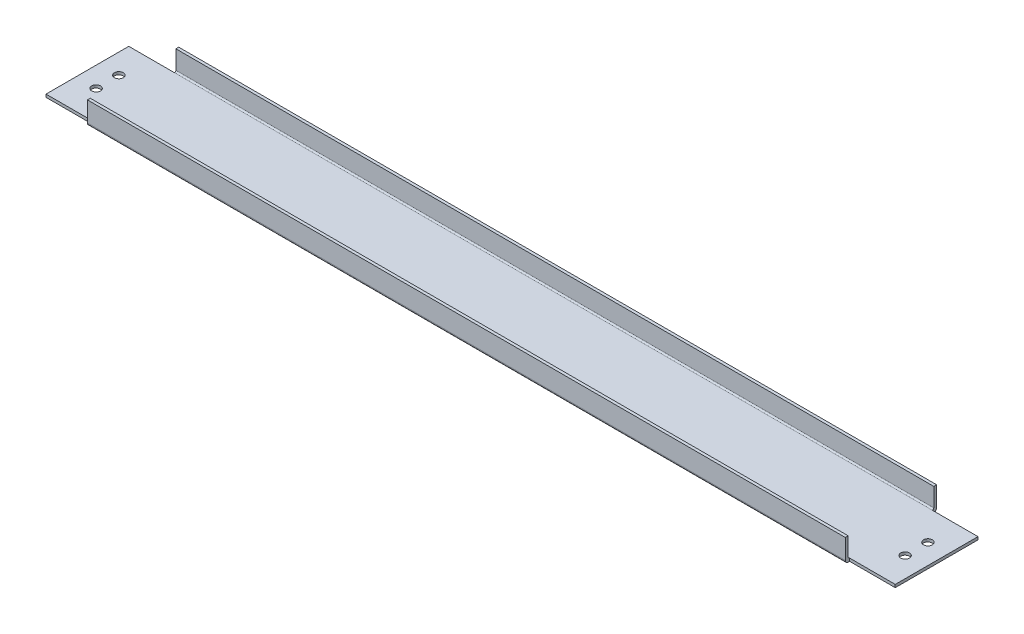
ISO-10303-21;
HEADER;
FILE_DESCRIPTION(('STEP AP214'),'2;1');
FILE_NAME('part.step','',(''),(''),'','','');
FILE_SCHEMA(('AUTOMOTIVE_DESIGN { 1 0 10303 214 1 1 1 1 }'));
ENDSEC;
DATA;
#1=APPLICATION_CONTEXT('core data for automotive mechanical design processes');
#2=APPLICATION_PROTOCOL_DEFINITION('international standard','automotive_design',2000,#1);
#3=PRODUCT_CONTEXT('',#1,'mechanical');
#4=PRODUCT('Part','Part','',(#3));
#5=PRODUCT_RELATED_PRODUCT_CATEGORY('part','',(#4));
#6=PRODUCT_DEFINITION_FORMATION('','',#4);
#7=PRODUCT_DEFINITION_CONTEXT('part definition',#1,'design');
#8=PRODUCT_DEFINITION('design','',#6,#7);
#9=PRODUCT_DEFINITION_SHAPE('','',#8);
#10=(LENGTH_UNIT() NAMED_UNIT(*) SI_UNIT(.MILLI.,.METRE.));
#11=(NAMED_UNIT(*) PLANE_ANGLE_UNIT() SI_UNIT($,.RADIAN.));
#12=(NAMED_UNIT(*) SI_UNIT($,.STERADIAN.) SOLID_ANGLE_UNIT());
#13=UNCERTAINTY_MEASURE_WITH_UNIT(LENGTH_MEASURE(1.E-05),#10,'distance_accuracy_value','');
#14=(GEOMETRIC_REPRESENTATION_CONTEXT(3) GLOBAL_UNCERTAINTY_ASSIGNED_CONTEXT((#13)) GLOBAL_UNIT_ASSIGNED_CONTEXT((#10,
#11,#12)) REPRESENTATION_CONTEXT('',''));
#15=CARTESIAN_POINT('',(0.,0.,0.));
#16=DIRECTION('',(0.,0.,1.));
#17=DIRECTION('',(1.,0.,0.));
#18=AXIS2_PLACEMENT_3D('',#15,#16,#17);
#19=CARTESIAN_POINT('',(-210.82,1.5875,23.8125));
#20=DIRECTION('',(1.,0.,0.));
#21=DIRECTION('',(0.,0.,1.));
#22=AXIS2_PLACEMENT_3D('',#19,#20,#21);
#23=PLANE('',#22);
#24=CARTESIAN_POINT('',(-210.82,2.38125,23.01875));
#25=DIRECTION('',(-1.,0.,0.));
#26=DIRECTION('',(0.,0.,1.));
#27=AXIS2_PLACEMENT_3D('',#24,#25,#26);
#28=CIRCLE('',#27,0.79375);
#29=CARTESIAN_POINT('',(-210.82,1.5875,23.01875));
#30=VERTEX_POINT('',#29);
#31=CARTESIAN_POINT('',(-210.82,2.38125000000001,23.8125));
#32=VERTEX_POINT('',#31);
#33=EDGE_CURVE('E414',#30,#32,#28,.T.);
#34=ORIENTED_EDGE('',*,*,#33,.F.);
#35=DIRECTION('',(0.,-1.,0.));
#36=VECTOR('',#35,1.);
#37=CARTESIAN_POINT('',(-210.82,1.5875,23.01875));
#38=LINE('',#37,#36);
#39=CARTESIAN_POINT('',(-210.82,0.,23.01875));
#40=VERTEX_POINT('',#39);
#41=EDGE_CURVE('E188',#30,#40,#38,.T.);
#42=ORIENTED_EDGE('',*,*,#41,.T.);
#43=DIRECTION('',(0.,0.,-1.));
#44=VECTOR('',#43,1.);
#45=CARTESIAN_POINT('',(-210.82,0.,23.8125));
#46=LINE('',#45,#44);
#47=CARTESIAN_POINT('',(-210.82,0.,23.8125));
#48=VERTEX_POINT('',#47);
#49=EDGE_CURVE('E284',#48,#40,#46,.T.);
#50=ORIENTED_EDGE('',*,*,#49,.F.);
#51=CARTESIAN_POINT('',(-210.82,1.5875,23.8125));
#52=DIRECTION('',(1.,0.,0.));
#53=DIRECTION('',(0.,0.,1.));
#54=AXIS2_PLACEMENT_3D('',#51,#52,#53);
#55=CIRCLE('',#54,1.5875);
#56=CARTESIAN_POINT('',(-210.82,1.58750000000001,25.4));
#57=VERTEX_POINT('',#56);
#58=EDGE_CURVE('E287',#57,#48,#55,.T.);
#59=ORIENTED_EDGE('',*,*,#58,.F.);
#60=DIRECTION('',(0.,-1.,0.));
#61=VECTOR('',#60,1.);
#62=CARTESIAN_POINT('',(-210.82,1.58750000000001,25.4));
#63=LINE('',#62,#61);
#64=CARTESIAN_POINT('',(-210.82,12.7,25.4));
#65=VERTEX_POINT('',#64);
#66=EDGE_CURVE('E301',#65,#57,#63,.T.);
#67=ORIENTED_EDGE('',*,*,#66,.F.);
#68=DIRECTION('',(0.,0.,1.));
#69=VECTOR('',#68,1.);
#70=CARTESIAN_POINT('',(-210.82,12.7,23.8125));
#71=LINE('',#70,#69);
#72=CARTESIAN_POINT('',(-210.82,12.7,23.8125));
#73=VERTEX_POINT('',#72);
#74=EDGE_CURVE('E177',#73,#65,#71,.T.);
#75=ORIENTED_EDGE('',*,*,#74,.F.);
#76=DIRECTION('',(0.,1.,0.));
#77=VECTOR('',#76,1.);
#78=CARTESIAN_POINT('',(-210.82,2.38125000000001,23.8125));
#79=LINE('',#78,#77);
#80=EDGE_CURVE('E419',#32,#73,#79,.T.);
#81=ORIENTED_EDGE('',*,*,#80,.F.);
#82=EDGE_LOOP('',(#34,#42,#50,#59,#67,#75,#81));
#83=FACE_BOUND('',#82,.T.);
#84=ADVANCED_FACE('F37',(#83),#23,.F.);
#85=CARTESIAN_POINT('',(210.82,1.5875,23.8125));
#86=DIRECTION('',(-1.,0.,0.));
#87=DIRECTION('',(0.,0.,1.));
#88=AXIS2_PLACEMENT_3D('',#85,#86,#87);
#89=PLANE('',#88);
#90=DIRECTION('',(0.,1.,0.));
#91=VECTOR('',#90,1.);
#92=CARTESIAN_POINT('',(210.82,0.,-23.01875));
#93=LINE('',#92,#91);
#94=CARTESIAN_POINT('',(210.82,0.,-23.01875));
#95=VERTEX_POINT('',#94);
#96=CARTESIAN_POINT('',(210.82,1.58750000000001,-23.01875));
#97=VERTEX_POINT('',#96);
#98=EDGE_CURVE('E54',#95,#97,#93,.T.);
#99=ORIENTED_EDGE('',*,*,#98,.F.);
#100=DIRECTION('',(0.,0.,-1.));
#101=VECTOR('',#100,1.);
#102=CARTESIAN_POINT('',(210.82,0.,23.8125));
#103=LINE('',#102,#101);
#104=CARTESIAN_POINT('',(210.82,0.,-23.8125));
#105=VERTEX_POINT('',#104);
#106=EDGE_CURVE('E322',#95,#105,#103,.T.);
#107=ORIENTED_EDGE('',*,*,#106,.T.);
#108=CARTESIAN_POINT('',(210.82,1.5875,-23.8125));
#109=DIRECTION('',(1.,0.,0.));
#110=DIRECTION('',(0.,0.,-1.));
#111=AXIS2_PLACEMENT_3D('',#108,#109,#110);
#112=CIRCLE('',#111,1.5875);
#113=CARTESIAN_POINT('',(210.82,1.58750000000001,-25.4));
#114=VERTEX_POINT('',#113);
#115=EDGE_CURVE('E350',#105,#114,#112,.T.);
#116=ORIENTED_EDGE('',*,*,#115,.T.);
#117=DIRECTION('',(0.,1.,0.));
#118=VECTOR('',#117,1.);
#119=CARTESIAN_POINT('',(210.82,12.7,-25.4));
#120=LINE('',#119,#118);
#121=CARTESIAN_POINT('',(210.82,12.7,-25.4));
#122=VERTEX_POINT('',#121);
#123=EDGE_CURVE('E391',#114,#122,#120,.T.);
#124=ORIENTED_EDGE('',*,*,#123,.T.);
#125=DIRECTION('',(0.,0.,1.));
#126=VECTOR('',#125,1.);
#127=CARTESIAN_POINT('',(210.82,12.7,-23.8125));
#128=LINE('',#127,#126);
#129=CARTESIAN_POINT('',(210.82,12.7,-23.8125));
#130=VERTEX_POINT('',#129);
#131=EDGE_CURVE('E390',#122,#130,#128,.T.);
#132=ORIENTED_EDGE('',*,*,#131,.T.);
#133=DIRECTION('',(0.,-1.,0.));
#134=VECTOR('',#133,1.);
#135=CARTESIAN_POINT('',(210.82,2.38125000000001,-23.8125));
#136=LINE('',#135,#134);
#137=CARTESIAN_POINT('',(210.82,2.38125000000001,-23.8125));
#138=VERTEX_POINT('',#137);
#139=EDGE_CURVE('E388',#130,#138,#136,.T.);
#140=ORIENTED_EDGE('',*,*,#139,.T.);
#141=CARTESIAN_POINT('',(210.82,2.38125000000001,-23.01875));
#142=DIRECTION('',(-1.,0.,0.));
#143=DIRECTION('',(0.,0.,1.));
#144=AXIS2_PLACEMENT_3D('',#141,#142,#143);
#145=CIRCLE('',#144,0.79375);
#146=EDGE_CURVE('E386',#138,#97,#145,.T.);
#147=ORIENTED_EDGE('',*,*,#146,.T.);
#148=EDGE_LOOP('',(#99,#107,#116,#124,#132,#140,#147));
#149=FACE_BOUND('',#148,.T.);
#150=ADVANCED_FACE('F252',(#149),#89,.F.);
#151=DIRECTION('',(0.,-1.,0.));
#152=VECTOR('',#151,1.);
#153=CARTESIAN_POINT('',(210.82,1.5875,23.01875));
#154=LINE('',#153,#152);
#155=CARTESIAN_POINT('',(210.82,1.5875,23.01875));
#156=VERTEX_POINT('',#155);
#157=CARTESIAN_POINT('',(210.82,0.,23.01875));
#158=VERTEX_POINT('',#157);
#159=EDGE_CURVE('E304',#156,#158,#154,.T.);
#160=ORIENTED_EDGE('',*,*,#159,.F.);
#161=CARTESIAN_POINT('',(210.82,2.38125,23.01875));
#162=DIRECTION('',(-1.,0.,0.));
#163=DIRECTION('',(0.,0.,1.));
#164=AXIS2_PLACEMENT_3D('',#161,#162,#163);
#165=CIRCLE('',#164,0.79375);
#166=CARTESIAN_POINT('',(210.82,2.38125000000001,23.8125));
#167=VERTEX_POINT('',#166);
#168=EDGE_CURVE('E384',#156,#167,#165,.T.);
#169=ORIENTED_EDGE('',*,*,#168,.T.);
#170=DIRECTION('',(0.,1.,0.));
#171=VECTOR('',#170,1.);
#172=CARTESIAN_POINT('',(210.82,2.38125000000001,23.8125));
#173=LINE('',#172,#171);
#174=CARTESIAN_POINT('',(210.82,12.7,23.8125));
#175=VERTEX_POINT('',#174);
#176=EDGE_CURVE('E62',#167,#175,#173,.T.);
#177=ORIENTED_EDGE('',*,*,#176,.T.);
#178=DIRECTION('',(0.,0.,1.));
#179=VECTOR('',#178,1.);
#180=CARTESIAN_POINT('',(210.82,12.7,23.8125));
#181=LINE('',#180,#179);
#182=CARTESIAN_POINT('',(210.82,12.7,25.4));
#183=VERTEX_POINT('',#182);
#184=EDGE_CURVE('E355',#175,#183,#181,.T.);
#185=ORIENTED_EDGE('',*,*,#184,.T.);
#186=DIRECTION('',(0.,-1.,0.));
#187=VECTOR('',#186,1.);
#188=CARTESIAN_POINT('',(210.82,1.58750000000001,25.4));
#189=LINE('',#188,#187);
#190=CARTESIAN_POINT('',(210.82,1.58750000000001,25.4));
#191=VERTEX_POINT('',#190);
#192=EDGE_CURVE('E351',#183,#191,#189,.T.);
#193=ORIENTED_EDGE('',*,*,#192,.T.);
#194=CARTESIAN_POINT('',(210.82,1.5875,23.8125));
#195=DIRECTION('',(1.,0.,0.));
#196=DIRECTION('',(0.,0.,1.));
#197=AXIS2_PLACEMENT_3D('',#194,#195,#196);
#198=CIRCLE('',#197,1.5875);
#199=CARTESIAN_POINT('',(210.82,0.,23.8125));
#200=VERTEX_POINT('',#199);
#201=EDGE_CURVE('E349',#191,#200,#198,.T.);
#202=ORIENTED_EDGE('',*,*,#201,.T.);
#203=EDGE_CURVE('E348',#200,#158,#103,.T.);
#204=ORIENTED_EDGE('',*,*,#203,.T.);
#205=EDGE_LOOP('',(#160,#169,#177,#185,#193,#202,#204));
#206=FACE_BOUND('',#205,.T.);
#207=ADVANCED_FACE('F259',(#206),#89,.F.);
#208=CARTESIAN_POINT('',(210.82,12.7,23.8125));
#209=DIRECTION('',(0.,-1.,0.));
#210=DIRECTION('',(0.,0.,-1.));
#211=AXIS2_PLACEMENT_3D('',#208,#209,#210);
#212=PLANE('',#211);
#213=DIRECTION('',(-1.,0.,0.));
#214=VECTOR('',#213,1.);
#215=CARTESIAN_POINT('',(210.82,12.7,23.8125));
#216=LINE('',#215,#214);
#217=EDGE_CURVE('E381',#175,#73,#216,.T.);
#218=ORIENTED_EDGE('',*,*,#217,.T.);
#219=ORIENTED_EDGE('',*,*,#74,.T.);
#220=DIRECTION('',(-1.,0.,0.));
#221=VECTOR('',#220,1.);
#222=CARTESIAN_POINT('',(210.82,12.7,25.4));
#223=LINE('',#222,#221);
#224=EDGE_CURVE('E11',#183,#65,#223,.T.);
#225=ORIENTED_EDGE('',*,*,#224,.F.);
#226=ORIENTED_EDGE('',*,*,#184,.F.);
#227=EDGE_LOOP('',(#218,#219,#225,#226));
#228=FACE_BOUND('',#227,.T.);
#229=ADVANCED_FACE('F39',(#228),#212,.F.);
#230=CARTESIAN_POINT('',(210.82,1.58750000000001,25.4));
#231=DIRECTION('',(0.,0.,-1.));
#232=DIRECTION('',(-1.,0.,0.));
#233=AXIS2_PLACEMENT_3D('',#230,#231,#232);
#234=PLANE('',#233);
#235=ORIENTED_EDGE('',*,*,#224,.T.);
#236=ORIENTED_EDGE('',*,*,#66,.T.);
#237=DIRECTION('',(-1.,0.,0.));
#238=VECTOR('',#237,1.);
#239=CARTESIAN_POINT('',(210.82,1.58750000000001,25.4));
#240=LINE('',#239,#238);
#241=EDGE_CURVE('E46',#191,#57,#240,.T.);
#242=ORIENTED_EDGE('',*,*,#241,.F.);
#243=ORIENTED_EDGE('',*,*,#192,.F.);
#244=EDGE_LOOP('',(#235,#236,#242,#243));
#245=FACE_BOUND('',#244,.T.);
#246=ADVANCED_FACE('F436',(#245),#234,.F.);
#247=CARTESIAN_POINT('',(210.82,1.5875,23.8125));
#248=DIRECTION('',(-1.,0.,0.));
#249=DIRECTION('',(0.,0.,1.));
#250=AXIS2_PLACEMENT_3D('',#247,#248,#249);
#251=CYLINDRICAL_SURFACE('',#250,1.5875);
#252=ORIENTED_EDGE('',*,*,#241,.T.);
#253=ORIENTED_EDGE('',*,*,#58,.T.);
#254=DIRECTION('',(-1.,0.,0.));
#255=VECTOR('',#254,1.);
#256=CARTESIAN_POINT('',(210.82,0.,23.8125));
#257=LINE('',#256,#255);
#258=EDGE_CURVE('E364',#200,#48,#257,.T.);
#259=ORIENTED_EDGE('',*,*,#258,.F.);
#260=ORIENTED_EDGE('',*,*,#201,.F.);
#261=EDGE_LOOP('',(#252,#253,#259,#260));
#262=FACE_BOUND('',#261,.T.);
#263=ADVANCED_FACE('F446',(#262),#251,.T.);
#264=CARTESIAN_POINT('',(210.82,0.,23.8125));
#265=DIRECTION('',(0.,1.,0.));
#266=DIRECTION('',(0.,0.,1.));
#267=AXIS2_PLACEMENT_3D('',#264,#265,#266);
#268=PLANE('',#267);
#269=CARTESIAN_POINT('',(-225.044,0.,6.35));
#270=DIRECTION('',(0.,1.,0.));
#271=DIRECTION('',(0.,0.,1.));
#272=AXIS2_PLACEMENT_3D('',#269,#270,#271);
#273=CIRCLE('',#272,2.45745);
#274=CARTESIAN_POINT('',(-225.044,0.,8.80745));
#275=VERTEX_POINT('',#274);
#276=EDGE_CURVE('E41',#275,#275,#273,.T.);
#277=ORIENTED_EDGE('',*,*,#276,.T.);
#278=EDGE_LOOP('',(#277));
#279=FACE_BOUND('',#278,.T.);
#280=CARTESIAN_POINT('',(-225.044,0.,-6.35));
#281=DIRECTION('',(0.,1.,0.));
#282=DIRECTION('',(0.,0.,1.));
#283=AXIS2_PLACEMENT_3D('',#280,#281,#282);
#284=CIRCLE('',#283,2.45745);
#285=CARTESIAN_POINT('',(-225.044,0.,-3.89255));
#286=VERTEX_POINT('',#285);
#287=EDGE_CURVE('E214',#286,#286,#284,.T.);
#288=ORIENTED_EDGE('',*,*,#287,.T.);
#289=EDGE_LOOP('',(#288));
#290=FACE_BOUND('',#289,.T.);
#291=CARTESIAN_POINT('',(225.044,0.,6.35));
#292=DIRECTION('',(0.,1.,0.));
#293=DIRECTION('',(0.,0.,1.));
#294=AXIS2_PLACEMENT_3D('',#291,#292,#293);
#295=CIRCLE('',#294,2.45745);
#296=CARTESIAN_POINT('',(225.044,0.,8.80745));
#297=VERTEX_POINT('',#296);
#298=EDGE_CURVE('E211',#297,#297,#295,.T.);
#299=ORIENTED_EDGE('',*,*,#298,.T.);
#300=EDGE_LOOP('',(#299));
#301=FACE_BOUND('',#300,.T.);
#302=CARTESIAN_POINT('',(225.044,0.,-6.35));
#303=DIRECTION('',(0.,1.,0.));
#304=DIRECTION('',(0.,0.,1.));
#305=AXIS2_PLACEMENT_3D('',#302,#303,#304);
#306=CIRCLE('',#305,2.45745);
#307=CARTESIAN_POINT('',(225.044,0.,-3.89255));
#308=VERTEX_POINT('',#307);
#309=EDGE_CURVE('E207',#308,#308,#306,.T.);
#310=ORIENTED_EDGE('',*,*,#309,.T.);
#311=EDGE_LOOP('',(#310));
#312=FACE_BOUND('',#311,.T.);
#313=ORIENTED_EDGE('',*,*,#258,.T.);
#314=ORIENTED_EDGE('',*,*,#49,.T.);
#315=DIRECTION('',(1.,0.,0.));
#316=VECTOR('',#315,1.);
#317=CARTESIAN_POINT('',(-236.22,0.,23.01875));
#318=LINE('',#317,#316);
#319=CARTESIAN_POINT('',(-236.22,0.,23.01875));
#320=VERTEX_POINT('',#319);
#321=EDGE_CURVE('E697',#320,#40,#318,.T.);
#322=ORIENTED_EDGE('',*,*,#321,.F.);
#323=DIRECTION('',(0.,0.,-1.));
#324=VECTOR('',#323,1.);
#325=CARTESIAN_POINT('',(-236.22,0.,23.01875));
#326=LINE('',#325,#324);
#327=CARTESIAN_POINT('',(-236.22,0.,-23.01875));
#328=VERTEX_POINT('',#327);
#329=EDGE_CURVE('E191',#320,#328,#326,.T.);
#330=ORIENTED_EDGE('',*,*,#329,.T.);
#331=DIRECTION('',(1.,0.,0.));
#332=VECTOR('',#331,1.);
#333=CARTESIAN_POINT('',(-236.22,0.,-23.01875));
#334=LINE('',#333,#332);
#335=CARTESIAN_POINT('',(-210.82,0.,-23.01875));
#336=VERTEX_POINT('',#335);
#337=EDGE_CURVE('E178',#328,#336,#334,.T.);
#338=ORIENTED_EDGE('',*,*,#337,.T.);
#339=CARTESIAN_POINT('',(-210.82,0.,-23.8125));
#340=VERTEX_POINT('',#339);
#341=EDGE_CURVE('E276',#336,#340,#46,.T.);
#342=ORIENTED_EDGE('',*,*,#341,.T.);
#343=DIRECTION('',(-1.,0.,0.));
#344=VECTOR('',#343,1.);
#345=CARTESIAN_POINT('',(210.82,0.,-23.8125));
#346=LINE('',#345,#344);
#347=EDGE_CURVE('E346',#105,#340,#346,.T.);
#348=ORIENTED_EDGE('',*,*,#347,.F.);
#349=ORIENTED_EDGE('',*,*,#106,.F.);
#350=DIRECTION('',(-1.,0.,0.));
#351=VECTOR('',#350,1.);
#352=CARTESIAN_POINT('',(236.22,0.,-23.01875));
#353=LINE('',#352,#351);
#354=CARTESIAN_POINT('',(236.22,0.,-23.01875));
#355=VERTEX_POINT('',#354);
#356=EDGE_CURVE('E329',#355,#95,#353,.T.);
#357=ORIENTED_EDGE('',*,*,#356,.F.);
#358=DIRECTION('',(0.,0.,-1.));
#359=VECTOR('',#358,1.);
#360=CARTESIAN_POINT('',(236.22,0.,23.01875));
#361=LINE('',#360,#359);
#362=CARTESIAN_POINT('',(236.22,0.,23.01875));
#363=VERTEX_POINT('',#362);
#364=EDGE_CURVE('E310',#363,#355,#361,.T.);
#365=ORIENTED_EDGE('',*,*,#364,.F.);
#366=DIRECTION('',(-1.,0.,0.));
#367=VECTOR('',#366,1.);
#368=CARTESIAN_POINT('',(236.22,0.,23.01875));
#369=LINE('',#368,#367);
#370=EDGE_CURVE('E325',#363,#158,#369,.T.);
#371=ORIENTED_EDGE('',*,*,#370,.T.);
#372=ORIENTED_EDGE('',*,*,#203,.F.);
#373=EDGE_LOOP('',(#313,#314,#322,#330,#338,#342,#348,#349,#357,#365,#371,#372));
#374=FACE_BOUND('',#373,.T.);
#375=ADVANCED_FACE('F345',(#279,#290,#301,#312,#374),#268,.F.);
#376=CARTESIAN_POINT('',(210.82,1.5875,-23.8125));
#377=DIRECTION('',(-1.,0.,0.));
#378=DIRECTION('',(0.,0.,1.));
#379=AXIS2_PLACEMENT_3D('',#376,#377,#378);
#380=CYLINDRICAL_SURFACE('',#379,1.5875);
#381=ORIENTED_EDGE('',*,*,#347,.T.);
#382=CARTESIAN_POINT('',(-210.82,1.5875,-23.8125));
#383=DIRECTION('',(1.,0.,0.));
#384=DIRECTION('',(0.,0.,-1.));
#385=AXIS2_PLACEMENT_3D('',#382,#383,#384);
#386=CIRCLE('',#385,1.5875);
#387=CARTESIAN_POINT('',(-210.82,1.58750000000001,-25.4));
#388=VERTEX_POINT('',#387);
#389=EDGE_CURVE('E280',#340,#388,#386,.T.);
#390=ORIENTED_EDGE('',*,*,#389,.T.);
#391=DIRECTION('',(-1.,0.,0.));
#392=VECTOR('',#391,1.);
#393=CARTESIAN_POINT('',(210.82,1.58750000000001,-25.4));
#394=LINE('',#393,#392);
#395=EDGE_CURVE('E367',#114,#388,#394,.T.);
#396=ORIENTED_EDGE('',*,*,#395,.F.);
#397=ORIENTED_EDGE('',*,*,#115,.F.);
#398=EDGE_LOOP('',(#381,#390,#396,#397));
#399=FACE_BOUND('',#398,.T.);
#400=ADVANCED_FACE('F396',(#399),#380,.T.);
#401=CARTESIAN_POINT('',(210.82,12.7,-25.4));
#402=DIRECTION('',(0.,0.,1.));
#403=DIRECTION('',(0.,-1.,0.));
#404=AXIS2_PLACEMENT_3D('',#401,#402,#403);
#405=PLANE('',#404);
#406=ORIENTED_EDGE('',*,*,#395,.T.);
#407=DIRECTION('',(0.,1.,0.));
#408=VECTOR('',#407,1.);
#409=CARTESIAN_POINT('',(-210.82,12.7,-25.4));
#410=LINE('',#409,#408);
#411=CARTESIAN_POINT('',(-210.82,12.7,-25.4));
#412=VERTEX_POINT('',#411);
#413=EDGE_CURVE('E289',#388,#412,#410,.T.);
#414=ORIENTED_EDGE('',*,*,#413,.T.);
#415=DIRECTION('',(-1.,0.,0.));
#416=VECTOR('',#415,1.);
#417=CARTESIAN_POINT('',(210.82,12.7,-25.4));
#418=LINE('',#417,#416);
#419=EDGE_CURVE('E369',#122,#412,#418,.T.);
#420=ORIENTED_EDGE('',*,*,#419,.F.);
#421=ORIENTED_EDGE('',*,*,#123,.F.);
#422=EDGE_LOOP('',(#406,#414,#420,#421));
#423=FACE_BOUND('',#422,.T.);
#424=ADVANCED_FACE('F399',(#423),#405,.F.);
#425=CARTESIAN_POINT('',(210.82,12.7,-23.8125));
#426=DIRECTION('',(0.,-1.,0.));
#427=DIRECTION('',(0.,0.,-1.));
#428=AXIS2_PLACEMENT_3D('',#425,#426,#427);
#429=PLANE('',#428);
#430=ORIENTED_EDGE('',*,*,#419,.T.);
#431=DIRECTION('',(0.,0.,1.));
#432=VECTOR('',#431,1.);
#433=CARTESIAN_POINT('',(-210.82,12.7,-23.8125));
#434=LINE('',#433,#432);
#435=CARTESIAN_POINT('',(-210.82,12.7,-23.8125));
#436=VERTEX_POINT('',#435);
#437=EDGE_CURVE('E416',#412,#436,#434,.T.);
#438=ORIENTED_EDGE('',*,*,#437,.T.);
#439=DIRECTION('',(-1.,0.,0.));
#440=VECTOR('',#439,1.);
#441=CARTESIAN_POINT('',(210.82,12.7,-23.8125));
#442=LINE('',#441,#440);
#443=EDGE_CURVE('E371',#130,#436,#442,.T.);
#444=ORIENTED_EDGE('',*,*,#443,.F.);
#445=ORIENTED_EDGE('',*,*,#131,.F.);
#446=EDGE_LOOP('',(#430,#438,#444,#445));
#447=FACE_BOUND('',#446,.T.);
#448=ADVANCED_FACE('F405',(#447),#429,.F.);
#449=CARTESIAN_POINT('',(210.82,2.38125000000001,-23.8125));
#450=DIRECTION('',(0.,0.,-1.));
#451=DIRECTION('',(0.,1.,0.));
#452=AXIS2_PLACEMENT_3D('',#449,#450,#451);
#453=PLANE('',#452);
#454=ORIENTED_EDGE('',*,*,#443,.T.);
#455=DIRECTION('',(0.,-1.,0.));
#456=VECTOR('',#455,1.);
#457=CARTESIAN_POINT('',(-210.82,2.38125000000001,-23.8125));
#458=LINE('',#457,#456);
#459=CARTESIAN_POINT('',(-210.82,2.38125000000001,-23.8125));
#460=VERTEX_POINT('',#459);
#461=EDGE_CURVE('E412',#436,#460,#458,.T.);
#462=ORIENTED_EDGE('',*,*,#461,.T.);
#463=DIRECTION('',(-1.,0.,0.));
#464=VECTOR('',#463,1.);
#465=CARTESIAN_POINT('',(210.82,2.38125000000001,-23.8125));
#466=LINE('',#465,#464);
#467=EDGE_CURVE('E373',#138,#460,#466,.T.);
#468=ORIENTED_EDGE('',*,*,#467,.F.);
#469=ORIENTED_EDGE('',*,*,#139,.F.);
#470=EDGE_LOOP('',(#454,#462,#468,#469));
#471=FACE_BOUND('',#470,.T.);
#472=ADVANCED_FACE('F246',(#471),#453,.F.);
#473=CARTESIAN_POINT('',(210.82,2.38125000000001,-23.01875));
#474=DIRECTION('',(-1.,0.,0.));
#475=DIRECTION('',(0.,0.,1.));
#476=AXIS2_PLACEMENT_3D('',#473,#474,#475);
#477=CYLINDRICAL_SURFACE('',#476,0.79375);
#478=ORIENTED_EDGE('',*,*,#467,.T.);
#479=CARTESIAN_POINT('',(-210.82,2.38125000000001,-23.01875));
#480=DIRECTION('',(-1.,0.,0.));
#481=DIRECTION('',(0.,0.,1.));
#482=AXIS2_PLACEMENT_3D('',#479,#480,#481);
#483=CIRCLE('',#482,0.79375);
#484=CARTESIAN_POINT('',(-210.82,1.58750000000001,-23.01875));
#485=VERTEX_POINT('',#484);
#486=EDGE_CURVE('E413',#460,#485,#483,.T.);
#487=ORIENTED_EDGE('',*,*,#486,.T.);
#488=DIRECTION('',(-1.,0.,0.));
#489=VECTOR('',#488,1.);
#490=CARTESIAN_POINT('',(210.82,1.58750000000001,-23.01875));
#491=LINE('',#490,#489);
#492=EDGE_CURVE('E171',#97,#485,#491,.T.);
#493=ORIENTED_EDGE('',*,*,#492,.F.);
#494=ORIENTED_EDGE('',*,*,#146,.F.);
#495=EDGE_LOOP('',(#478,#487,#493,#494));
#496=FACE_BOUND('',#495,.T.);
#497=ADVANCED_FACE('F236',(#496),#477,.F.);
#498=CARTESIAN_POINT('',(210.82,1.5875,23.01875));
#499=DIRECTION('',(0.,-1.,0.));
#500=DIRECTION('',(0.,0.,-1.));
#501=AXIS2_PLACEMENT_3D('',#498,#499,#500);
#502=PLANE('',#501);
#503=CARTESIAN_POINT('',(-225.044,1.5875,6.35));
#504=DIRECTION('',(0.,1.,0.));
#505=DIRECTION('',(0.,0.,1.));
#506=AXIS2_PLACEMENT_3D('',#503,#504,#505);
#507=CIRCLE('',#506,2.45745);
#508=CARTESIAN_POINT('',(-225.044,1.5875,8.80745));
#509=VERTEX_POINT('',#508);
#510=EDGE_CURVE('E226',#509,#509,#507,.T.);
#511=ORIENTED_EDGE('',*,*,#510,.F.);
#512=EDGE_LOOP('',(#511));
#513=FACE_BOUND('',#512,.T.);
#514=CARTESIAN_POINT('',(-225.044,1.58750000000001,-6.35));
#515=DIRECTION('',(0.,1.,0.));
#516=DIRECTION('',(0.,0.,1.));
#517=AXIS2_PLACEMENT_3D('',#514,#515,#516);
#518=CIRCLE('',#517,2.45745);
#519=CARTESIAN_POINT('',(-225.044,1.58750000000001,-3.89255));
#520=VERTEX_POINT('',#519);
#521=EDGE_CURVE('E216',#520,#520,#518,.T.);
#522=ORIENTED_EDGE('',*,*,#521,.F.);
#523=EDGE_LOOP('',(#522));
#524=FACE_BOUND('',#523,.T.);
#525=CARTESIAN_POINT('',(225.044,1.5875,6.35));
#526=DIRECTION('',(0.,1.,0.));
#527=DIRECTION('',(0.,0.,1.));
#528=AXIS2_PLACEMENT_3D('',#525,#526,#527);
#529=CIRCLE('',#528,2.45745);
#530=CARTESIAN_POINT('',(225.044,1.5875,8.80745));
#531=VERTEX_POINT('',#530);
#532=EDGE_CURVE('E213',#531,#531,#529,.T.);
#533=ORIENTED_EDGE('',*,*,#532,.F.);
#534=EDGE_LOOP('',(#533));
#535=FACE_BOUND('',#534,.T.);
#536=CARTESIAN_POINT('',(225.044,1.58750000000001,-6.35));
#537=DIRECTION('',(0.,1.,0.));
#538=DIRECTION('',(0.,0.,1.));
#539=AXIS2_PLACEMENT_3D('',#536,#537,#538);
#540=CIRCLE('',#539,2.45745);
#541=CARTESIAN_POINT('',(225.044,1.58750000000001,-3.89255));
#542=VERTEX_POINT('',#541);
#543=EDGE_CURVE('E210',#542,#542,#540,.T.);
#544=ORIENTED_EDGE('',*,*,#543,.F.);
#545=EDGE_LOOP('',(#544));
#546=FACE_BOUND('',#545,.T.);
#547=ORIENTED_EDGE('',*,*,#492,.T.);
#548=DIRECTION('',(1.,0.,0.));
#549=VECTOR('',#548,1.);
#550=CARTESIAN_POINT('',(-236.22,1.58750000000001,-23.01875));
#551=LINE('',#550,#549);
#552=CARTESIAN_POINT('',(-236.22,1.58750000000001,-23.01875));
#553=VERTEX_POINT('',#552);
#554=EDGE_CURVE('E164',#553,#485,#551,.T.);
#555=ORIENTED_EDGE('',*,*,#554,.F.);
#556=DIRECTION('',(0.,0.,1.));
#557=VECTOR('',#556,1.);
#558=CARTESIAN_POINT('',(-236.22,1.58750000000001,-23.01875));
#559=LINE('',#558,#557);
#560=CARTESIAN_POINT('',(-236.22,1.5875,23.01875));
#561=VERTEX_POINT('',#560);
#562=EDGE_CURVE('E167',#553,#561,#559,.T.);
#563=ORIENTED_EDGE('',*,*,#562,.T.);
#564=DIRECTION('',(1.,0.,0.));
#565=VECTOR('',#564,1.);
#566=CARTESIAN_POINT('',(-236.22,1.5875,23.01875));
#567=LINE('',#566,#565);
#568=EDGE_CURVE('E197',#561,#30,#567,.T.);
#569=ORIENTED_EDGE('',*,*,#568,.T.);
#570=DIRECTION('',(-1.,0.,0.));
#571=VECTOR('',#570,1.);
#572=CARTESIAN_POINT('',(210.82,1.5875,23.01875));
#573=LINE('',#572,#571);
#574=EDGE_CURVE('E376',#156,#30,#573,.T.);
#575=ORIENTED_EDGE('',*,*,#574,.F.);
#576=DIRECTION('',(-1.,0.,0.));
#577=VECTOR('',#576,1.);
#578=CARTESIAN_POINT('',(236.22,1.5875,23.01875));
#579=LINE('',#578,#577);
#580=CARTESIAN_POINT('',(236.22,1.5875,23.01875));
#581=VERTEX_POINT('',#580);
#582=EDGE_CURVE('E328',#581,#156,#579,.T.);
#583=ORIENTED_EDGE('',*,*,#582,.F.);
#584=DIRECTION('',(0.,0.,1.));
#585=VECTOR('',#584,1.);
#586=CARTESIAN_POINT('',(236.22,1.58750000000001,-23.01875));
#587=LINE('',#586,#585);
#588=CARTESIAN_POINT('',(236.22,1.58750000000001,-23.01875));
#589=VERTEX_POINT('',#588);
#590=EDGE_CURVE('E305',#589,#581,#587,.T.);
#591=ORIENTED_EDGE('',*,*,#590,.F.);
#592=DIRECTION('',(-1.,0.,0.));
#593=VECTOR('',#592,1.);
#594=CARTESIAN_POINT('',(236.22,1.58750000000001,-23.01875));
#595=LINE('',#594,#593);
#596=EDGE_CURVE('E314',#589,#97,#595,.T.);
#597=ORIENTED_EDGE('',*,*,#596,.T.);
#598=EDGE_LOOP('',(#547,#555,#563,#569,#575,#583,#591,#597));
#599=FACE_BOUND('',#598,.T.);
#600=ADVANCED_FACE('F166',(#513,#524,#535,#546,#599),#502,.F.);
#601=CARTESIAN_POINT('',(210.82,2.38125,23.01875));
#602=DIRECTION('',(-1.,0.,0.));
#603=DIRECTION('',(0.,0.,1.));
#604=AXIS2_PLACEMENT_3D('',#601,#602,#603);
#605=CYLINDRICAL_SURFACE('',#604,0.79375);
#606=ORIENTED_EDGE('',*,*,#574,.T.);
#607=ORIENTED_EDGE('',*,*,#33,.T.);
#608=DIRECTION('',(-1.,0.,0.));
#609=VECTOR('',#608,1.);
#610=CARTESIAN_POINT('',(210.82,2.38125000000001,23.8125));
#611=LINE('',#610,#609);
#612=EDGE_CURVE('E379',#167,#32,#611,.T.);
#613=ORIENTED_EDGE('',*,*,#612,.F.);
#614=ORIENTED_EDGE('',*,*,#168,.F.);
#615=EDGE_LOOP('',(#606,#607,#613,#614));
#616=FACE_BOUND('',#615,.T.);
#617=ADVANCED_FACE('F235',(#616),#605,.F.);
#618=CARTESIAN_POINT('',(210.82,2.38125000000001,23.8125));
#619=DIRECTION('',(0.,0.,1.));
#620=DIRECTION('',(1.,0.,0.));
#621=AXIS2_PLACEMENT_3D('',#618,#619,#620);
#622=PLANE('',#621);
#623=ORIENTED_EDGE('',*,*,#612,.T.);
#624=ORIENTED_EDGE('',*,*,#80,.T.);
#625=ORIENTED_EDGE('',*,*,#217,.F.);
#626=ORIENTED_EDGE('',*,*,#176,.F.);
#627=EDGE_LOOP('',(#623,#624,#625,#626));
#628=FACE_BOUND('',#627,.T.);
#629=ADVANCED_FACE('F243',(#628),#622,.F.);
#630=CARTESIAN_POINT('',(236.22,1.5875,23.01875));
#631=DIRECTION('',(0.,0.,-1.));
#632=DIRECTION('',(0.,1.,0.));
#633=AXIS2_PLACEMENT_3D('',#630,#631,#632);
#634=PLANE('',#633);
#635=ORIENTED_EDGE('',*,*,#159,.T.);
#636=ORIENTED_EDGE('',*,*,#370,.F.);
#637=DIRECTION('',(0.,-1.,0.));
#638=VECTOR('',#637,1.);
#639=CARTESIAN_POINT('',(236.22,1.5875,23.01875));
#640=LINE('',#639,#638);
#641=EDGE_CURVE('E308',#581,#363,#640,.T.);
#642=ORIENTED_EDGE('',*,*,#641,.F.);
#643=ORIENTED_EDGE('',*,*,#582,.T.);
#644=EDGE_LOOP('',(#635,#636,#642,#643));
#645=FACE_BOUND('',#644,.T.);
#646=ADVANCED_FACE('F439',(#645),#634,.F.);
#647=CARTESIAN_POINT('',(236.22,0.,-23.01875));
#648=DIRECTION('',(0.,0.,1.));
#649=DIRECTION('',(0.,-1.,0.));
#650=AXIS2_PLACEMENT_3D('',#647,#648,#649);
#651=PLANE('',#650);
#652=ORIENTED_EDGE('',*,*,#98,.T.);
#653=ORIENTED_EDGE('',*,*,#596,.F.);
#654=DIRECTION('',(0.,1.,0.));
#655=VECTOR('',#654,1.);
#656=CARTESIAN_POINT('',(236.22,0.,-23.01875));
#657=LINE('',#656,#655);
#658=EDGE_CURVE('E312',#355,#589,#657,.T.);
#659=ORIENTED_EDGE('',*,*,#658,.F.);
#660=ORIENTED_EDGE('',*,*,#356,.T.);
#661=EDGE_LOOP('',(#652,#653,#659,#660));
#662=FACE_BOUND('',#661,.T.);
#663=ADVANCED_FACE('F272',(#662),#651,.F.);
#664=CARTESIAN_POINT('',(236.22,0.,0.));
#665=DIRECTION('',(1.,0.,0.));
#666=DIRECTION('',(0.,0.,-1.));
#667=AXIS2_PLACEMENT_3D('',#664,#665,#666);
#668=PLANE('',#667);
#669=ORIENTED_EDGE('',*,*,#590,.T.);
#670=ORIENTED_EDGE('',*,*,#641,.T.);
#671=ORIENTED_EDGE('',*,*,#364,.T.);
#672=ORIENTED_EDGE('',*,*,#658,.T.);
#673=EDGE_LOOP('',(#669,#670,#671,#672));
#674=FACE_BOUND('',#673,.T.);
#675=ADVANCED_FACE('F265',(#674),#668,.T.);
#676=ORIENTED_EDGE('',*,*,#341,.F.);
#677=DIRECTION('',(0.,1.,0.));
#678=VECTOR('',#677,1.);
#679=CARTESIAN_POINT('',(-210.82,0.,-23.01875));
#680=LINE('',#679,#678);
#681=EDGE_CURVE('E204',#336,#485,#680,.T.);
#682=ORIENTED_EDGE('',*,*,#681,.T.);
#683=ORIENTED_EDGE('',*,*,#486,.F.);
#684=ORIENTED_EDGE('',*,*,#461,.F.);
#685=ORIENTED_EDGE('',*,*,#437,.F.);
#686=ORIENTED_EDGE('',*,*,#413,.F.);
#687=ORIENTED_EDGE('',*,*,#389,.F.);
#688=EDGE_LOOP('',(#676,#682,#683,#684,#685,#686,#687));
#689=FACE_BOUND('',#688,.T.);
#690=ADVANCED_FACE('F255',(#689),#23,.F.);
#691=CARTESIAN_POINT('',(-236.22,0.,-23.01875));
#692=DIRECTION('',(0.,0.,-1.));
#693=DIRECTION('',(0.,1.,0.));
#694=AXIS2_PLACEMENT_3D('',#691,#692,#693);
#695=PLANE('',#694);
#696=ORIENTED_EDGE('',*,*,#681,.F.);
#697=ORIENTED_EDGE('',*,*,#337,.F.);
#698=DIRECTION('',(0.,1.,0.));
#699=VECTOR('',#698,1.);
#700=CARTESIAN_POINT('',(-236.22,0.,-23.01875));
#701=LINE('',#700,#699);
#702=EDGE_CURVE('E184',#328,#553,#701,.T.);
#703=ORIENTED_EDGE('',*,*,#702,.T.);
#704=ORIENTED_EDGE('',*,*,#554,.T.);
#705=EDGE_LOOP('',(#696,#697,#703,#704));
#706=FACE_BOUND('',#705,.T.);
#707=ADVANCED_FACE('F190',(#706),#695,.T.);
#708=CARTESIAN_POINT('',(-236.22,1.5875,23.01875));
#709=DIRECTION('',(0.,0.,1.));
#710=DIRECTION('',(0.,-1.,0.));
#711=AXIS2_PLACEMENT_3D('',#708,#709,#710);
#712=PLANE('',#711);
#713=ORIENTED_EDGE('',*,*,#41,.F.);
#714=ORIENTED_EDGE('',*,*,#568,.F.);
#715=DIRECTION('',(0.,-1.,0.));
#716=VECTOR('',#715,1.);
#717=CARTESIAN_POINT('',(-236.22,1.5875,23.01875));
#718=LINE('',#717,#716);
#719=EDGE_CURVE('E187',#561,#320,#718,.T.);
#720=ORIENTED_EDGE('',*,*,#719,.T.);
#721=ORIENTED_EDGE('',*,*,#321,.T.);
#722=EDGE_LOOP('',(#713,#714,#720,#721));
#723=FACE_BOUND('',#722,.T.);
#724=ADVANCED_FACE('F271',(#723),#712,.T.);
#725=CARTESIAN_POINT('',(-236.22,0.,0.));
#726=DIRECTION('',(-1.,0.,0.));
#727=DIRECTION('',(0.,0.,-1.));
#728=AXIS2_PLACEMENT_3D('',#725,#726,#727);
#729=PLANE('',#728);
#730=ORIENTED_EDGE('',*,*,#562,.F.);
#731=ORIENTED_EDGE('',*,*,#702,.F.);
#732=ORIENTED_EDGE('',*,*,#329,.F.);
#733=ORIENTED_EDGE('',*,*,#719,.F.);
#734=EDGE_LOOP('',(#730,#731,#732,#733));
#735=FACE_BOUND('',#734,.T.);
#736=ADVANCED_FACE('F182',(#735),#729,.T.);
#737=CARTESIAN_POINT('',(225.044,1.58750000000001,-6.35));
#738=DIRECTION('',(0.,1.,0.));
#739=DIRECTION('',(0.,0.,1.));
#740=AXIS2_PLACEMENT_3D('',#737,#738,#739);
#741=CYLINDRICAL_SURFACE('',#740,2.45745);
#742=ORIENTED_EDGE('',*,*,#543,.T.);
#743=EDGE_LOOP('',(#742));
#744=FACE_BOUND('',#743,.T.);
#745=ORIENTED_EDGE('',*,*,#309,.F.);
#746=EDGE_LOOP('',(#745));
#747=FACE_BOUND('',#746,.T.);
#748=ADVANCED_FACE('F231',(#744,#747),#741,.F.);
#749=CARTESIAN_POINT('',(225.044,1.5875,6.35));
#750=DIRECTION('',(0.,1.,0.));
#751=DIRECTION('',(0.,0.,1.));
#752=AXIS2_PLACEMENT_3D('',#749,#750,#751);
#753=CYLINDRICAL_SURFACE('',#752,2.45745);
#754=ORIENTED_EDGE('',*,*,#532,.T.);
#755=EDGE_LOOP('',(#754));
#756=FACE_BOUND('',#755,.T.);
#757=ORIENTED_EDGE('',*,*,#298,.F.);
#758=EDGE_LOOP('',(#757));
#759=FACE_BOUND('',#758,.T.);
#760=ADVANCED_FACE('F529',(#756,#759),#753,.F.);
#761=CARTESIAN_POINT('',(-225.044,1.58750000000001,-6.35));
#762=DIRECTION('',(0.,1.,0.));
#763=DIRECTION('',(0.,0.,1.));
#764=AXIS2_PLACEMENT_3D('',#761,#762,#763);
#765=CYLINDRICAL_SURFACE('',#764,2.45745);
#766=ORIENTED_EDGE('',*,*,#521,.T.);
#767=EDGE_LOOP('',(#766));
#768=FACE_BOUND('',#767,.T.);
#769=ORIENTED_EDGE('',*,*,#287,.F.);
#770=EDGE_LOOP('',(#769));
#771=FACE_BOUND('',#770,.T.);
#772=ADVANCED_FACE('F538',(#768,#771),#765,.F.);
#773=CARTESIAN_POINT('',(-225.044,1.5875,6.35));
#774=DIRECTION('',(0.,1.,0.));
#775=DIRECTION('',(0.,0.,1.));
#776=AXIS2_PLACEMENT_3D('',#773,#774,#775);
#777=CYLINDRICAL_SURFACE('',#776,2.45745);
#778=ORIENTED_EDGE('',*,*,#510,.T.);
#779=EDGE_LOOP('',(#778));
#780=FACE_BOUND('',#779,.T.);
#781=ORIENTED_EDGE('',*,*,#276,.F.);
#782=EDGE_LOOP('',(#781));
#783=FACE_BOUND('',#782,.T.);
#784=ADVANCED_FACE('F558',(#780,#783),#777,.F.);
#785=CLOSED_SHELL('',(#84,#150,#207,#229,#246,#263,#375,#400,#424,#448,#472,#497,#600,#617,#629,
#646,#663,#675,#690,#707,#724,#736,#748,#760,#772,#784));
#786=MANIFOLD_SOLID_BREP('B2',#785);
#787=ADVANCED_BREP_SHAPE_REPRESENTATION('',(#18,#786),#14);
#788=SHAPE_DEFINITION_REPRESENTATION(#9,#787);
ENDSEC;
END-ISO-10303-21;
